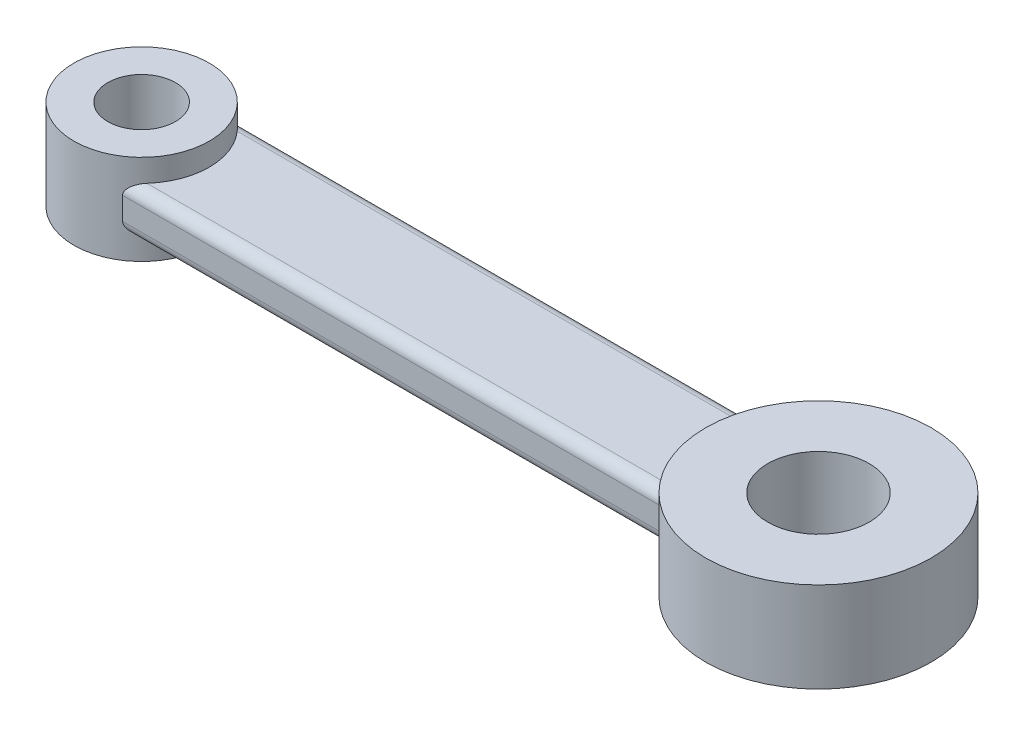
ISO-10303-21;
HEADER;
FILE_DESCRIPTION(('STEP AP214'),'2;1');
FILE_NAME('part.step','',(''),(''),'','','');
FILE_SCHEMA(('AUTOMOTIVE_DESIGN { 1 0 10303 214 1 1 1 1 }'));
ENDSEC;
DATA;
#1=APPLICATION_CONTEXT('core data for automotive mechanical design processes');
#2=APPLICATION_PROTOCOL_DEFINITION('international standard','automotive_design',2000,#1);
#3=PRODUCT_CONTEXT('',#1,'mechanical');
#4=PRODUCT('Part','Part','',(#3));
#5=PRODUCT_RELATED_PRODUCT_CATEGORY('part','',(#4));
#6=PRODUCT_DEFINITION_FORMATION('','',#4);
#7=PRODUCT_DEFINITION_CONTEXT('part definition',#1,'design');
#8=PRODUCT_DEFINITION('design','',#6,#7);
#9=PRODUCT_DEFINITION_SHAPE('','',#8);
#10=(LENGTH_UNIT() NAMED_UNIT(*) SI_UNIT(.MILLI.,.METRE.));
#11=(NAMED_UNIT(*) PLANE_ANGLE_UNIT() SI_UNIT($,.RADIAN.));
#12=(NAMED_UNIT(*) SI_UNIT($,.STERADIAN.) SOLID_ANGLE_UNIT());
#13=UNCERTAINTY_MEASURE_WITH_UNIT(LENGTH_MEASURE(1.E-05),#10,'distance_accuracy_value','');
#14=(GEOMETRIC_REPRESENTATION_CONTEXT(3) GLOBAL_UNCERTAINTY_ASSIGNED_CONTEXT((#13)) GLOBAL_UNIT_ASSIGNED_CONTEXT((#10,
#11,#12)) REPRESENTATION_CONTEXT('',''));
#15=CARTESIAN_POINT('',(0.,0.,0.));
#16=DIRECTION('',(0.,0.,1.));
#17=DIRECTION('',(1.,0.,0.));
#18=AXIS2_PLACEMENT_3D('',#15,#16,#17);
#19=CARTESIAN_POINT('',(-15.,1.,-2.5));
#20=DIRECTION('',(0.,0.,1.));
#21=DIRECTION('',(1.,0.,0.));
#22=AXIS2_PLACEMENT_3D('',#19,#20,#21);
#23=PLANE('',#22);
#24=DIRECTION('',(0.,1.,0.));
#25=VECTOR('',#24,1.);
#26=CARTESIAN_POINT('',(10.6698729810778,-2.,-2.5));
#27=LINE('',#26,#25);
#28=CARTESIAN_POINT('',(10.6698729810778,0.5,-2.5));
#29=VERTEX_POINT('',#28);
#30=CARTESIAN_POINT('',(10.6698729810778,-0.5,-2.5));
#31=VERTEX_POINT('',#30);
#32=EDGE_CURVE('E143',#29,#31,#27,.F.);
#33=ORIENTED_EDGE('',*,*,#32,.T.);
#34=DIRECTION('',(-1.,0.,0.));
#35=VECTOR('',#34,1.);
#36=CARTESIAN_POINT('',(-13.3416876048223,-0.5,-2.5));
#37=LINE('',#36,#35);
#38=CARTESIAN_POINT('',(-13.3416876048223,-0.5,-2.5));
#39=VERTEX_POINT('',#38);
#40=EDGE_CURVE('E270',#31,#39,#37,.T.);
#41=ORIENTED_EDGE('',*,*,#40,.T.);
#42=DIRECTION('',(0.,1.,0.));
#43=VECTOR('',#42,1.);
#44=CARTESIAN_POINT('',(-13.3416876048223,-2.,-2.5));
#45=LINE('',#44,#43);
#46=CARTESIAN_POINT('',(-13.3416876048223,0.5,-2.5));
#47=VERTEX_POINT('',#46);
#48=EDGE_CURVE('E161',#39,#47,#45,.T.);
#49=ORIENTED_EDGE('',*,*,#48,.T.);
#50=DIRECTION('',(-1.,0.,0.));
#51=VECTOR('',#50,1.);
#52=CARTESIAN_POINT('',(-15.,0.5,-2.5));
#53=LINE('',#52,#51);
#54=EDGE_CURVE('E123',#47,#29,#53,.F.);
#55=ORIENTED_EDGE('',*,*,#54,.T.);
#56=EDGE_LOOP('',(#33,#41,#49,#55));
#57=FACE_BOUND('',#56,.T.);
#58=ADVANCED_FACE('F39',(#57),#23,.F.);
#59=CARTESIAN_POINT('',(-15.,1.,2.5));
#60=DIRECTION('',(0.,0.,-1.));
#61=DIRECTION('',(-1.,0.,0.));
#62=AXIS2_PLACEMENT_3D('',#59,#60,#61);
#63=PLANE('',#62);
#64=DIRECTION('',(0.,1.,0.));
#65=VECTOR('',#64,1.);
#66=CARTESIAN_POINT('',(-13.3416876048223,-2.,2.5));
#67=LINE('',#66,#65);
#68=CARTESIAN_POINT('',(-13.3416876048223,0.5,2.5));
#69=VERTEX_POINT('',#68);
#70=CARTESIAN_POINT('',(-13.3416876048223,-0.5,2.5));
#71=VERTEX_POINT('',#70);
#72=EDGE_CURVE('E158',#69,#71,#67,.F.);
#73=ORIENTED_EDGE('',*,*,#72,.T.);
#74=DIRECTION('',(1.,0.,0.));
#75=VECTOR('',#74,1.);
#76=CARTESIAN_POINT('',(10.6698729810778,-0.5,2.5));
#77=LINE('',#76,#75);
#78=CARTESIAN_POINT('',(10.6698729810778,-0.5,2.5));
#79=VERTEX_POINT('',#78);
#80=EDGE_CURVE('E283',#71,#79,#77,.T.);
#81=ORIENTED_EDGE('',*,*,#80,.T.);
#82=DIRECTION('',(0.,1.,0.));
#83=VECTOR('',#82,1.);
#84=CARTESIAN_POINT('',(10.6698729810778,-2.,2.5));
#85=LINE('',#84,#83);
#86=CARTESIAN_POINT('',(10.6698729810778,0.5,2.5));
#87=VERTEX_POINT('',#86);
#88=EDGE_CURVE('E151',#79,#87,#85,.T.);
#89=ORIENTED_EDGE('',*,*,#88,.T.);
#90=DIRECTION('',(1.,0.,0.));
#91=VECTOR('',#90,1.);
#92=CARTESIAN_POINT('',(-15.,0.5,2.5));
#93=LINE('',#92,#91);
#94=EDGE_CURVE('E117',#87,#69,#93,.F.);
#95=ORIENTED_EDGE('',*,*,#94,.T.);
#96=EDGE_LOOP('',(#73,#81,#89,#95));
#97=FACE_BOUND('',#96,.T.);
#98=ADVANCED_FACE('F258',(#97),#63,.F.);
#99=CARTESIAN_POINT('',(0.,1.,0.));
#100=DIRECTION('',(0.,-1.,0.));
#101=DIRECTION('',(0.,0.,-1.));
#102=AXIS2_PLACEMENT_3D('',#99,#100,#101);
#103=PLANE('',#102);
#104=CARTESIAN_POINT('',(-15.,1.,0.));
#105=DIRECTION('',(0.,-1.,0.));
#106=DIRECTION('',(0.,0.,-1.));
#107=AXIS2_PLACEMENT_3D('',#104,#105,#106);
#108=CIRCLE('',#107,3.);
#109=CARTESIAN_POINT('',(-12.7639320225002,1.,-2.));
#110=VERTEX_POINT('',#109);
#111=CARTESIAN_POINT('',(-12.7639320225002,1.,2.));
#112=VERTEX_POINT('',#111);
#113=EDGE_CURVE('E133',#110,#112,#108,.T.);
#114=ORIENTED_EDGE('',*,*,#113,.T.);
#115=DIRECTION('',(1.,0.,0.));
#116=VECTOR('',#115,1.);
#117=CARTESIAN_POINT('',(0.,1.,2.));
#118=LINE('',#117,#116);
#119=CARTESIAN_POINT('',(10.4174243050442,1.,2.));
#120=VERTEX_POINT('',#119);
#121=EDGE_CURVE('E116',#112,#120,#118,.T.);
#122=ORIENTED_EDGE('',*,*,#121,.T.);
#123=CARTESIAN_POINT('',(15.,1.,0.));
#124=DIRECTION('',(0.,-1.,0.));
#125=DIRECTION('',(0.,0.,-1.));
#126=AXIS2_PLACEMENT_3D('',#123,#124,#125);
#127=CIRCLE('',#126,5.);
#128=CARTESIAN_POINT('',(10.4174243050442,1.,-2.));
#129=VERTEX_POINT('',#128);
#130=EDGE_CURVE('E130',#120,#129,#127,.T.);
#131=ORIENTED_EDGE('',*,*,#130,.T.);
#132=DIRECTION('',(-1.,0.,0.));
#133=VECTOR('',#132,1.);
#134=CARTESIAN_POINT('',(0.,1.,-2.));
#135=LINE('',#134,#133);
#136=EDGE_CURVE('E135',#129,#110,#135,.T.);
#137=ORIENTED_EDGE('',*,*,#136,.T.);
#138=EDGE_LOOP('',(#114,#122,#131,#137));
#139=FACE_BOUND('',#138,.T.);
#140=ADVANCED_FACE('F128',(#139),#103,.F.);
#141=CARTESIAN_POINT('',(0.,-1.,0.));
#142=DIRECTION('',(0.,-1.,0.));
#143=DIRECTION('',(0.,0.,-1.));
#144=AXIS2_PLACEMENT_3D('',#141,#142,#143);
#145=PLANE('',#144);
#146=CARTESIAN_POINT('',(-15.,-1.,0.));
#147=DIRECTION('',(0.,-1.,0.));
#148=DIRECTION('',(0.,0.,-1.));
#149=AXIS2_PLACEMENT_3D('',#146,#147,#148);
#150=CIRCLE('',#149,3.);
#151=CARTESIAN_POINT('',(-12.7639320225002,-1.,-2.));
#152=VERTEX_POINT('',#151);
#153=CARTESIAN_POINT('',(-12.7639320225002,-1.,2.));
#154=VERTEX_POINT('',#153);
#155=EDGE_CURVE('E166',#152,#154,#150,.T.);
#156=ORIENTED_EDGE('',*,*,#155,.F.);
#157=DIRECTION('',(-1.,0.,0.));
#158=VECTOR('',#157,1.);
#159=CARTESIAN_POINT('',(10.6698729810778,-1.,-2.));
#160=LINE('',#159,#158);
#161=CARTESIAN_POINT('',(10.4174243050442,-1.,-2.));
#162=VERTEX_POINT('',#161);
#163=EDGE_CURVE('E279',#152,#162,#160,.F.);
#164=ORIENTED_EDGE('',*,*,#163,.T.);
#165=CARTESIAN_POINT('',(15.,-1.,0.));
#166=DIRECTION('',(0.,-1.,0.));
#167=DIRECTION('',(0.,0.,-1.));
#168=AXIS2_PLACEMENT_3D('',#165,#166,#167);
#169=CIRCLE('',#168,5.);
#170=CARTESIAN_POINT('',(10.4174243050442,-1.,2.));
#171=VERTEX_POINT('',#170);
#172=EDGE_CURVE('E169',#171,#162,#169,.T.);
#173=ORIENTED_EDGE('',*,*,#172,.F.);
#174=DIRECTION('',(1.,0.,0.));
#175=VECTOR('',#174,1.);
#176=CARTESIAN_POINT('',(-13.3416876048223,-1.,2.));
#177=LINE('',#176,#175);
#178=EDGE_CURVE('E276',#171,#154,#177,.F.);
#179=ORIENTED_EDGE('',*,*,#178,.T.);
#180=EDGE_LOOP('',(#156,#164,#173,#179));
#181=FACE_BOUND('',#180,.T.);
#182=ADVANCED_FACE('F251',(#181),#145,.T.);
#183=CARTESIAN_POINT('',(-15.,-2.,0.));
#184=DIRECTION('',(0.,1.,0.));
#185=DIRECTION('',(0.,0.,1.));
#186=AXIS2_PLACEMENT_3D('',#183,#184,#185);
#187=CYLINDRICAL_SURFACE('',#186,3.);
#188=CARTESIAN_POINT('',(-15.,2.,0.));
#189=DIRECTION('',(0.,1.,0.));
#190=DIRECTION('',(0.,0.,1.));
#191=AXIS2_PLACEMENT_3D('',#188,#189,#190);
#192=CIRCLE('',#191,3.);
#193=CARTESIAN_POINT('',(-15.,2.,3.));
#194=VERTEX_POINT('',#193);
#195=EDGE_CURVE('E142',#194,#194,#192,.T.);
#196=ORIENTED_EDGE('',*,*,#195,.F.);
#197=EDGE_LOOP('',(#196));
#198=FACE_BOUND('',#197,.T.);
#199=CARTESIAN_POINT('',(-15.,-2.,0.));
#200=DIRECTION('',(0.,1.,0.));
#201=DIRECTION('',(0.,0.,1.));
#202=AXIS2_PLACEMENT_3D('',#199,#200,#201);
#203=CIRCLE('',#202,3.);
#204=CARTESIAN_POINT('',(-15.,-2.,3.));
#205=VERTEX_POINT('',#204);
#206=EDGE_CURVE('E148',#205,#205,#203,.T.);
#207=ORIENTED_EDGE('',*,*,#206,.T.);
#208=EDGE_LOOP('',(#207));
#209=FACE_BOUND('',#208,.T.);
#210=ORIENTED_EDGE('',*,*,#113,.F.);
#211=CARTESIAN_POINT('',(-12.7639320225002,1.,-2.));
#212=CARTESIAN_POINT('',(-12.7813654476687,0.999994445505588,-2.01949359100221));
#213=CARTESIAN_POINT('',(-12.7990411982709,0.998860689409976,-2.03873973865839));
#214=CARTESIAN_POINT('',(-12.8347538799835,0.994462119045316,-2.07662835943884));
#215=CARTESIAN_POINT('',(-12.852790626118,0.991198370402259,-2.09527112953772));
#216=CARTESIAN_POINT('',(-12.9076020696579,0.978323441096924,-2.15048074103013));
#217=CARTESIAN_POINT('',(-12.9447688062129,0.965632732151298,-2.18598404750585));
#218=CARTESIAN_POINT('',(-13.0192478946805,0.932517419205082,-2.25370503782496));
#219=CARTESIAN_POINT('',(-13.0565586313246,0.91202546732388,-2.28589091694261));
#220=CARTESIAN_POINT('',(-13.1293986280466,0.863149345748445,-2.34585586658739));
#221=CARTESIAN_POINT('',(-13.1649355034373,0.834803098801269,-2.37365512924547));
#222=CARTESIAN_POINT('',(-13.2134157867939,0.786693537335127,-2.41008159609968));
#223=CARTESIAN_POINT('',(-13.2282305627463,0.77051442886312,-2.4209784232059));
#224=CARTESIAN_POINT('',(-13.2563018122169,0.735966323835231,-2.44127284364817));
#225=CARTESIAN_POINT('',(-13.2695588902018,0.717598182347025,-2.4506710190469));
#226=CARTESIAN_POINT('',(-13.2916368924699,0.681832933624495,-2.4660993865668));
#227=CARTESIAN_POINT('',(-13.3008288662582,0.664798901283837,-2.47243043798102));
#228=CARTESIAN_POINT('',(-13.316869821903,0.629191119527252,-2.48337805890216));
#229=CARTESIAN_POINT('',(-13.323728233179,0.610623952757903,-2.48800153498784));
#230=CARTESIAN_POINT('',(-13.3331088580339,0.576776472396585,-2.4942934128244));
#231=CARTESIAN_POINT('',(-13.3362732595262,0.561758751665526,-2.49640228766915));
#232=CARTESIAN_POINT('',(-13.3405867010465,0.531177106703895,-2.49926985925382));
#233=CARTESIAN_POINT('',(-13.341717317729,0.515609479249297,-2.50001621429648));
#234=CARTESIAN_POINT('',(-13.3416876048223,0.5,-2.5));
#235=B_SPLINE_CURVE_WITH_KNOTS('',3,(#211,#212,#213,#214,#215,#216,#217,#218,#219,#220,#221,
#222,#223,#224,#225,#226,#227,#228,#229,#230,#231,#232,#233,#234),.UNSPECIFIED.,.F.,.F.,(4,2,2,
2,2,2,2,2,2,2,2,4),(0.,0.0783898255899012,0.156740463124989,0.314814052922462,0.474284423262263,
0.632997854342967,0.706343937197132,0.779661463349925,0.840552451401913,0.901194386001923,
0.947478734399757,0.994180284616168),.UNSPECIFIED.);
#236=EDGE_CURVE('E239',#110,#47,#235,.T.);
#237=ORIENTED_EDGE('',*,*,#236,.T.);
#238=ORIENTED_EDGE('',*,*,#48,.F.);
#239=CARTESIAN_POINT('',(-13.3416876048223,-0.5,-2.5));
#240=CARTESIAN_POINT('',(-13.3417261843022,-0.516822828872651,-2.50002105286584));
#241=CARTESIAN_POINT('',(-13.3404092208518,-0.533588035639853,-2.49915221414259));
#242=CARTESIAN_POINT('',(-13.3354207657719,-0.5664186633773,-2.49583463220209));
#243=CARTESIAN_POINT('',(-13.331775766552,-0.58248981299817,-2.49340366371562));
#244=CARTESIAN_POINT('',(-13.3212853755202,-0.617734402460636,-2.48635547100785));
#245=CARTESIAN_POINT('',(-13.3138602042168,-0.636651250821247,-2.4813383345804));
#246=CARTESIAN_POINT('',(-13.2966528423177,-0.672857175590583,-2.46955837238611));
#247=CARTESIAN_POINT('',(-13.2868594057681,-0.690137920998039,-2.46278720615986));
#248=CARTESIAN_POINT('',(-13.2598012797917,-0.732020883020507,-2.4437894695714));
#249=CARTESIAN_POINT('',(-13.2413857026041,-0.755437426624356,-2.43060816292195));
#250=CARTESIAN_POINT('',(-13.2023221847601,-0.79862956558678,-2.40186392098692));
#251=CARTESIAN_POINT('',(-13.181669278916,-0.818396788205838,-2.38629565530459));
#252=CARTESIAN_POINT('',(-13.1272613592604,-0.864813010713485,-2.34405563022038));
#253=CARTESIAN_POINT('',(-13.0926078348558,-0.889174909431484,-2.31602411273898));
#254=CARTESIAN_POINT('',(-13.0223124130272,-0.930852018605409,-2.25630082488321));
#255=CARTESIAN_POINT('',(-12.9866699758398,-0.948163296566734,-2.22460702448013));
#256=CARTESIAN_POINT('',(-12.9192688936088,-0.974262726817669,-2.16158611525089));
#257=CARTESIAN_POINT('',(-12.8874952717848,-0.983754765132756,-2.13056968957407));
#258=CARTESIAN_POINT('',(-12.8405209139538,-0.993401569683879,-2.08258288363253));
#259=CARTESIAN_POINT('',(-12.8249971533039,-0.995851742814894,-2.06636592206632));
#260=CARTESIAN_POINT('',(-12.7942318431726,-0.999149835544836,-2.03349327256699));
#261=CARTESIAN_POINT('',(-12.7789904352089,-0.999996972112432,-2.01683737425293));
#262=CARTESIAN_POINT('',(-12.7639320225002,-1.,-2.));
#263=B_SPLINE_CURVE_WITH_KNOTS('',3,(#239,#240,#241,#242,#243,#244,#245,#246,#247,#248,#249,
#250,#251,#252,#253,#254,#255,#256,#257,#258,#259,#260,#261,#262),.UNSPECIFIED.,.F.,.F.,(4,2,2,
2,2,2,2,2,2,2,2,4),(0.,0.0503015075969909,0.100040556265486,0.162488885380412,0.225239790152478,
0.322423307703855,0.419827097896708,0.571404223192908,0.723065775469024,0.858808614579746,
0.926501808526239,0.994228059873951),.UNSPECIFIED.);
#264=EDGE_CURVE('E219',#39,#152,#263,.T.);
#265=ORIENTED_EDGE('',*,*,#264,.T.);
#266=ORIENTED_EDGE('',*,*,#155,.T.);
#267=CARTESIAN_POINT('',(-12.7639320225002,-1.,2.));
#268=CARTESIAN_POINT('',(-12.7813654476687,-0.999994445505588,2.01949359100221));
#269=CARTESIAN_POINT('',(-12.7990411982709,-0.998860689409976,2.03873973865839));
#270=CARTESIAN_POINT('',(-12.8347538799835,-0.994462119045316,2.07662835943884));
#271=CARTESIAN_POINT('',(-12.852790626118,-0.991198370402259,2.09527112953772));
#272=CARTESIAN_POINT('',(-12.9076020696579,-0.978323441096924,2.15048074103013));
#273=CARTESIAN_POINT('',(-12.9447688062129,-0.965632732151298,2.18598404750585));
#274=CARTESIAN_POINT('',(-13.0192478946805,-0.932517419205082,2.25370503782496));
#275=CARTESIAN_POINT('',(-13.0565586313246,-0.91202546732388,2.28589091694261));
#276=CARTESIAN_POINT('',(-13.1293986280466,-0.863149345748445,2.34585586658739));
#277=CARTESIAN_POINT('',(-13.1649355034373,-0.834803098801269,2.37365512924547));
#278=CARTESIAN_POINT('',(-13.2134157867939,-0.786693537335127,2.41008159609968));
#279=CARTESIAN_POINT('',(-13.2282305627463,-0.77051442886312,2.4209784232059));
#280=CARTESIAN_POINT('',(-13.2563018122169,-0.735966323835231,2.44127284364817));
#281=CARTESIAN_POINT('',(-13.2695588902018,-0.717598182347025,2.4506710190469));
#282=CARTESIAN_POINT('',(-13.2916368924699,-0.681832933624495,2.4660993865668));
#283=CARTESIAN_POINT('',(-13.3008288662582,-0.664798901283837,2.47243043798102));
#284=CARTESIAN_POINT('',(-13.316869821903,-0.629191119527252,2.48337805890216));
#285=CARTESIAN_POINT('',(-13.323728233179,-0.610623952757903,2.48800153498784));
#286=CARTESIAN_POINT('',(-13.3331088580339,-0.576776472396585,2.4942934128244));
#287=CARTESIAN_POINT('',(-13.3362732595262,-0.561758751665526,2.49640228766915));
#288=CARTESIAN_POINT('',(-13.3405867010465,-0.531177106703895,2.49926985925382));
#289=CARTESIAN_POINT('',(-13.341717317729,-0.515609479249297,2.50001621429648));
#290=CARTESIAN_POINT('',(-13.3416876048223,-0.5,2.5));
#291=B_SPLINE_CURVE_WITH_KNOTS('',3,(#267,#268,#269,#270,#271,#272,#273,#274,#275,#276,#277,
#278,#279,#280,#281,#282,#283,#284,#285,#286,#287,#288,#289,#290),.UNSPECIFIED.,.F.,.F.,(4,2,2,
2,2,2,2,2,2,2,2,4),(0.,0.0783898255899012,0.156740463124989,0.314814052922462,0.474284423262263,
0.632997854342967,0.706343937197132,0.779661463349925,0.840552451401913,0.901194386001923,
0.947478734399757,0.994180284616168),.UNSPECIFIED.);
#292=EDGE_CURVE('E11',#154,#71,#291,.T.);
#293=ORIENTED_EDGE('',*,*,#292,.T.);
#294=ORIENTED_EDGE('',*,*,#72,.F.);
#295=CARTESIAN_POINT('',(-13.3416876048223,0.5,2.5));
#296=CARTESIAN_POINT('',(-13.3417261843022,0.516822828872651,2.50002105286584));
#297=CARTESIAN_POINT('',(-13.3404092208518,0.533588035639853,2.49915221414259));
#298=CARTESIAN_POINT('',(-13.3354207657719,0.5664186633773,2.49583463220209));
#299=CARTESIAN_POINT('',(-13.331775766552,0.58248981299817,2.49340366371562));
#300=CARTESIAN_POINT('',(-13.3212853755202,0.617734402460636,2.48635547100785));
#301=CARTESIAN_POINT('',(-13.3138602042168,0.636651250821247,2.4813383345804));
#302=CARTESIAN_POINT('',(-13.2966528423177,0.672857175590583,2.46955837238611));
#303=CARTESIAN_POINT('',(-13.2868594057681,0.690137920998039,2.46278720615986));
#304=CARTESIAN_POINT('',(-13.2598012797917,0.732020883020507,2.4437894695714));
#305=CARTESIAN_POINT('',(-13.2413857026041,0.755437426624356,2.43060816292195));
#306=CARTESIAN_POINT('',(-13.2023221847601,0.79862956558678,2.40186392098692));
#307=CARTESIAN_POINT('',(-13.181669278916,0.818396788205838,2.38629565530459));
#308=CARTESIAN_POINT('',(-13.1272613592604,0.864813010713485,2.34405563022038));
#309=CARTESIAN_POINT('',(-13.0926078348558,0.889174909431484,2.31602411273898));
#310=CARTESIAN_POINT('',(-13.0223124130272,0.930852018605409,2.25630082488321));
#311=CARTESIAN_POINT('',(-12.9866699758398,0.948163296566734,2.22460702448013));
#312=CARTESIAN_POINT('',(-12.9192688936088,0.974262726817669,2.16158611525089));
#313=CARTESIAN_POINT('',(-12.8874952717848,0.983754765132756,2.13056968957407));
#314=CARTESIAN_POINT('',(-12.8405209139538,0.993401569683879,2.08258288363253));
#315=CARTESIAN_POINT('',(-12.8249971533039,0.995851742814894,2.06636592206632));
#316=CARTESIAN_POINT('',(-12.7942318431726,0.999149835544836,2.03349327256699));
#317=CARTESIAN_POINT('',(-12.7789904352089,0.999996972112432,2.01683737425293));
#318=CARTESIAN_POINT('',(-12.7639320225002,1.,2.));
#319=B_SPLINE_CURVE_WITH_KNOTS('',3,(#295,#296,#297,#298,#299,#300,#301,#302,#303,#304,#305,
#306,#307,#308,#309,#310,#311,#312,#313,#314,#315,#316,#317,#318),.UNSPECIFIED.,.F.,.F.,(4,2,2,
2,2,2,2,2,2,2,2,4),(0.,0.0503015075969909,0.100040556265486,0.162488885380412,0.225239790152478,
0.322423307703855,0.419827097896708,0.571404223192908,0.723065775469024,0.858808614579746,
0.926501808526239,0.994228059873951),.UNSPECIFIED.);
#320=EDGE_CURVE('E122',#69,#112,#319,.T.);
#321=ORIENTED_EDGE('',*,*,#320,.T.);
#322=EDGE_LOOP('',(#210,#237,#238,#265,#266,#293,#294,#321));
#323=FACE_BOUND('',#322,.T.);
#324=ADVANCED_FACE('F246',(#198,#209,#323),#187,.T.);
#325=CARTESIAN_POINT('',(-15.,-2.,0.));
#326=DIRECTION('',(0.,1.,0.));
#327=DIRECTION('',(0.,0.,1.));
#328=AXIS2_PLACEMENT_3D('',#325,#326,#327);
#329=PLANE('',#328);
#330=CARTESIAN_POINT('',(-15.,-2.,0.));
#331=DIRECTION('',(0.,1.,0.));
#332=DIRECTION('',(0.,0.,1.));
#333=AXIS2_PLACEMENT_3D('',#330,#331,#332);
#334=CIRCLE('',#333,1.5);
#335=CARTESIAN_POINT('',(-15.,-2.,1.5));
#336=VERTEX_POINT('',#335);
#337=EDGE_CURVE('E404',#336,#336,#334,.T.);
#338=ORIENTED_EDGE('',*,*,#337,.T.);
#339=EDGE_LOOP('',(#338));
#340=FACE_BOUND('',#339,.T.);
#341=ORIENTED_EDGE('',*,*,#206,.F.);
#342=EDGE_LOOP('',(#341));
#343=FACE_BOUND('',#342,.T.);
#344=ADVANCED_FACE('F250',(#340,#343),#329,.F.);
#345=CARTESIAN_POINT('',(-15.,2.,0.));
#346=DIRECTION('',(0.,1.,0.));
#347=DIRECTION('',(0.,0.,1.));
#348=AXIS2_PLACEMENT_3D('',#345,#346,#347);
#349=PLANE('',#348);
#350=CARTESIAN_POINT('',(-15.,2.,0.));
#351=DIRECTION('',(0.,1.,0.));
#352=DIRECTION('',(0.,0.,1.));
#353=AXIS2_PLACEMENT_3D('',#350,#351,#352);
#354=CIRCLE('',#353,1.5);
#355=CARTESIAN_POINT('',(-15.,2.,1.5));
#356=VERTEX_POINT('',#355);
#357=EDGE_CURVE('E418',#356,#356,#354,.T.);
#358=ORIENTED_EDGE('',*,*,#357,.F.);
#359=EDGE_LOOP('',(#358));
#360=FACE_BOUND('',#359,.T.);
#361=ORIENTED_EDGE('',*,*,#195,.T.);
#362=EDGE_LOOP('',(#361));
#363=FACE_BOUND('',#362,.T.);
#364=ADVANCED_FACE('F198',(#360,#363),#349,.T.);
#365=CARTESIAN_POINT('',(15.,-2.,0.));
#366=DIRECTION('',(0.,1.,0.));
#367=DIRECTION('',(0.,0.,1.));
#368=AXIS2_PLACEMENT_3D('',#365,#366,#367);
#369=CYLINDRICAL_SURFACE('',#368,5.);
#370=CARTESIAN_POINT('',(15.,2.,0.));
#371=DIRECTION('',(0.,1.,0.));
#372=DIRECTION('',(0.,0.,1.));
#373=AXIS2_PLACEMENT_3D('',#370,#371,#372);
#374=CIRCLE('',#373,5.);
#375=CARTESIAN_POINT('',(15.,2.,5.));
#376=VERTEX_POINT('',#375);
#377=EDGE_CURVE('E409',#376,#376,#374,.T.);
#378=ORIENTED_EDGE('',*,*,#377,.F.);
#379=EDGE_LOOP('',(#378));
#380=FACE_BOUND('',#379,.T.);
#381=CARTESIAN_POINT('',(15.,-2.,0.));
#382=DIRECTION('',(0.,1.,0.));
#383=DIRECTION('',(0.,0.,1.));
#384=AXIS2_PLACEMENT_3D('',#381,#382,#383);
#385=CIRCLE('',#384,5.);
#386=CARTESIAN_POINT('',(15.,-2.,5.));
#387=VERTEX_POINT('',#386);
#388=EDGE_CURVE('E415',#387,#387,#385,.T.);
#389=ORIENTED_EDGE('',*,*,#388,.T.);
#390=EDGE_LOOP('',(#389));
#391=FACE_BOUND('',#390,.T.);
#392=ORIENTED_EDGE('',*,*,#130,.F.);
#393=CARTESIAN_POINT('',(10.4174243050442,1.,2.));
#394=CARTESIAN_POINT('',(10.4308993122192,1.00000668411266,2.03090713408897));
#395=CARTESIAN_POINT('',(10.4447039401755,0.997135472019669,2.06165377228773));
#396=CARTESIAN_POINT('',(10.4725286894914,0.985847081121915,2.1220451699756));
#397=CARTESIAN_POINT('',(10.4865489837027,0.977425200239371,2.15168897271939));
#398=CARTESIAN_POINT('',(10.5143400785477,0.955243483074812,2.20904517815308));
#399=CARTESIAN_POINT('',(10.5281108215857,0.941482430543113,2.23675713907633));
#400=CARTESIAN_POINT('',(10.5548568403228,0.90887514057721,2.28944814596292));
#401=CARTESIAN_POINT('',(10.5678322674685,0.890029875009769,2.31442771295254));
#402=CARTESIAN_POINT('',(10.5920858366771,0.848049596030432,2.36028643277072));
#403=CARTESIAN_POINT('',(10.6033953938408,0.825019699021244,2.38124465132102));
#404=CARTESIAN_POINT('',(10.6239700555222,0.774857640279251,2.41884733117823));
#405=CARTESIAN_POINT('',(10.6332362447518,0.747727668005086,2.43549408202948));
#406=CARTESIAN_POINT('',(10.6481452710197,0.693260940033863,2.46202512624276));
#407=CARTESIAN_POINT('',(10.6540714225199,0.666263235098591,2.47244574035165));
#408=CARTESIAN_POINT('',(10.6632424806366,0.610480842853648,2.48849793296531));
#409=CARTESIAN_POINT('',(10.6664949910704,0.58170147536064,2.49414309416744));
#410=CARTESIAN_POINT('',(10.6688048900758,0.543880128652656,2.49814915942994));
#411=CARTESIAN_POINT('',(10.6692052417715,0.535117663391557,2.49884310090582));
#412=CARTESIAN_POINT('',(10.6697389009958,0.517571703120912,2.49976785029613));
#413=CARTESIAN_POINT('',(10.6698725567911,0.508788250553156,2.4999992622088));
#414=CARTESIAN_POINT('',(10.6698729810778,0.499999999999999,2.5));
#415=B_SPLINE_CURVE_WITH_KNOTS('',3,(#393,#394,#395,#396,#397,#398,#399,#400,#401,#402,#403,
#404,#405,#406,#407,#408,#409,#410,#411,#412,#413,#414),.UNSPECIFIED.,.F.,.F.,(4,2,2,2,2,2,2,2,
2,2,4),(0.,0.101008056687019,0.202101789401094,0.303218564543173,0.404316024505445,
0.5031573664606,0.601946111988946,0.690061209732679,0.777924833155257,0.804310453809253,
0.830661596001267),.UNSPECIFIED.);
#416=EDGE_CURVE('E112',#120,#87,#415,.T.);
#417=ORIENTED_EDGE('',*,*,#416,.T.);
#418=ORIENTED_EDGE('',*,*,#88,.F.);
#419=CARTESIAN_POINT('',(10.6698729810778,-0.5,2.5));
#420=CARTESIAN_POINT('',(10.6698985355678,-0.525612881621549,2.50003287097852));
#421=CARTESIAN_POINT('',(10.6687380943918,-0.551192250511684,2.49803439435345));
#422=CARTESIAN_POINT('',(10.6642525448032,-0.601452812449729,2.4902467325129));
#423=CARTESIAN_POINT('',(10.660937695083,-0.626137679730771,2.4844755112987));
#424=CARTESIAN_POINT('',(10.6523519091098,-0.674007047252389,2.46941816042085));
#425=CARTESIAN_POINT('',(10.6470831491012,-0.697193183151707,2.4601359410405));
#426=CARTESIAN_POINT('',(10.634898343239,-0.741602484171483,2.43845092893676));
#427=CARTESIAN_POINT('',(10.6279806704541,-0.762823681652599,2.42604505351337));
#428=CARTESIAN_POINT('',(10.6123827180238,-0.804100789207547,2.39772599891138));
#429=CARTESIAN_POINT('',(10.6036223097161,-0.824013239100391,2.38164860868134));
#430=CARTESIAN_POINT('',(10.5850117154092,-0.860906890769571,2.34696954655862));
#431=CARTESIAN_POINT('',(10.5751611545275,-0.87788707902639,2.3283670058143));
#432=CARTESIAN_POINT('',(10.5534319049278,-0.910652876745179,2.28662446045481));
#433=CARTESIAN_POINT('',(10.5414538612551,-0.926020801860714,2.26320800664285));
#434=CARTESIAN_POINT('',(10.5169891099007,-0.952577466309947,2.21435359560162));
#435=CARTESIAN_POINT('',(10.5045021720283,-0.963764290584012,2.18891471849988));
#436=CARTESIAN_POINT('',(10.4794346311887,-0.981751717696796,2.13666090445053));
#437=CARTESIAN_POINT('',(10.4668543431243,-0.988563290873172,2.10984959258686));
#438=CARTESIAN_POINT('',(10.4419031729363,-0.997688369801676,2.05540070834236));
#439=CARTESIAN_POINT('',(10.4295321600039,-1.00000479665528,2.02776368440381));
#440=CARTESIAN_POINT('',(10.4174243050442,-1.,2.));
#441=B_SPLINE_CURVE_WITH_KNOTS('',3,(#419,#420,#421,#422,#423,#424,#425,#426,#427,#428,#429,
#430,#431,#432,#433,#434,#435,#436,#437,#438,#439,#440),.UNSPECIFIED.,.F.,.F.,(4,2,2,2,2,2,2,2,
2,2,4),(0.,0.0766818511881102,0.153001213844694,0.229235826870433,0.305545971876533,
0.386375804023659,0.467233518862885,0.558243654907134,0.649295425170199,0.740117995204918,
0.83088152580391),.UNSPECIFIED.);
#442=EDGE_CURVE('E54',#79,#171,#441,.T.);
#443=ORIENTED_EDGE('',*,*,#442,.T.);
#444=ORIENTED_EDGE('',*,*,#172,.T.);
#445=CARTESIAN_POINT('',(10.4174243050442,-1.,-2.));
#446=CARTESIAN_POINT('',(10.4308993122192,-1.00000668411266,-2.03090713408897));
#447=CARTESIAN_POINT('',(10.4447039401755,-0.997135472019669,-2.06165377228773));
#448=CARTESIAN_POINT('',(10.4725286894914,-0.985847081121915,-2.1220451699756));
#449=CARTESIAN_POINT('',(10.4865489837027,-0.977425200239371,-2.15168897271939));
#450=CARTESIAN_POINT('',(10.5143400785477,-0.955243483074812,-2.20904517815308));
#451=CARTESIAN_POINT('',(10.5281108215857,-0.941482430543113,-2.23675713907633));
#452=CARTESIAN_POINT('',(10.5548568403228,-0.90887514057721,-2.28944814596292));
#453=CARTESIAN_POINT('',(10.5678322674685,-0.890029875009769,-2.31442771295254));
#454=CARTESIAN_POINT('',(10.5920858366771,-0.848049596030432,-2.36028643277072));
#455=CARTESIAN_POINT('',(10.6033953938408,-0.825019699021244,-2.38124465132102));
#456=CARTESIAN_POINT('',(10.6239700555222,-0.774857640279251,-2.41884733117823));
#457=CARTESIAN_POINT('',(10.6332362447518,-0.747727668005086,-2.43549408202948));
#458=CARTESIAN_POINT('',(10.6481452710197,-0.693260940033863,-2.46202512624276));
#459=CARTESIAN_POINT('',(10.6540714225199,-0.666263235098591,-2.47244574035165));
#460=CARTESIAN_POINT('',(10.6632424806366,-0.610480842853648,-2.48849793296531));
#461=CARTESIAN_POINT('',(10.6664949910704,-0.58170147536064,-2.49414309416744));
#462=CARTESIAN_POINT('',(10.6688048900758,-0.543880128652656,-2.49814915942994));
#463=CARTESIAN_POINT('',(10.6692052417715,-0.535117663391557,-2.49884310090582));
#464=CARTESIAN_POINT('',(10.6697389009958,-0.517571703120912,-2.49976785029613));
#465=CARTESIAN_POINT('',(10.6698725567911,-0.508788250553156,-2.4999992622088));
#466=CARTESIAN_POINT('',(10.6698729810778,-0.499999999999999,-2.5));
#467=B_SPLINE_CURVE_WITH_KNOTS('',3,(#445,#446,#447,#448,#449,#450,#451,#452,#453,#454,#455,
#456,#457,#458,#459,#460,#461,#462,#463,#464,#465,#466),.UNSPECIFIED.,.F.,.F.,(4,2,2,2,2,2,2,2,
2,2,4),(0.,0.101008056687019,0.202101789401094,0.303218564543173,0.404316024505445,
0.5031573664606,0.601946111988946,0.690061209732679,0.777924833155257,0.804310453809253,
0.830661596001267),.UNSPECIFIED.);
#468=EDGE_CURVE('E212',#162,#31,#467,.T.);
#469=ORIENTED_EDGE('',*,*,#468,.T.);
#470=ORIENTED_EDGE('',*,*,#32,.F.);
#471=CARTESIAN_POINT('',(10.6698729810778,0.5,-2.5));
#472=CARTESIAN_POINT('',(10.6698985355678,0.525612881621549,-2.50003287097852));
#473=CARTESIAN_POINT('',(10.6687380943918,0.551192250511684,-2.49803439435345));
#474=CARTESIAN_POINT('',(10.6642525448032,0.601452812449729,-2.4902467325129));
#475=CARTESIAN_POINT('',(10.660937695083,0.626137679730771,-2.4844755112987));
#476=CARTESIAN_POINT('',(10.6523519091098,0.674007047252389,-2.46941816042085));
#477=CARTESIAN_POINT('',(10.6470831491012,0.697193183151707,-2.4601359410405));
#478=CARTESIAN_POINT('',(10.634898343239,0.741602484171483,-2.43845092893676));
#479=CARTESIAN_POINT('',(10.6279806704541,0.762823681652599,-2.42604505351337));
#480=CARTESIAN_POINT('',(10.6123827180238,0.804100789207547,-2.39772599891138));
#481=CARTESIAN_POINT('',(10.6036223097161,0.824013239100391,-2.38164860868134));
#482=CARTESIAN_POINT('',(10.5850117154092,0.860906890769571,-2.34696954655862));
#483=CARTESIAN_POINT('',(10.5751611545275,0.87788707902639,-2.3283670058143));
#484=CARTESIAN_POINT('',(10.5534319049278,0.910652876745179,-2.28662446045481));
#485=CARTESIAN_POINT('',(10.5414538612551,0.926020801860714,-2.26320800664285));
#486=CARTESIAN_POINT('',(10.5169891099007,0.952577466309947,-2.21435359560162));
#487=CARTESIAN_POINT('',(10.5045021720283,0.963764290584012,-2.18891471849988));
#488=CARTESIAN_POINT('',(10.4794346311887,0.981751717696796,-2.13666090445053));
#489=CARTESIAN_POINT('',(10.4668543431243,0.988563290873172,-2.10984959258686));
#490=CARTESIAN_POINT('',(10.4419031729363,0.997688369801676,-2.05540070834236));
#491=CARTESIAN_POINT('',(10.4295321600039,1.00000479665528,-2.02776368440381));
#492=CARTESIAN_POINT('',(10.4174243050442,1.,-2.));
#493=B_SPLINE_CURVE_WITH_KNOTS('',3,(#471,#472,#473,#474,#475,#476,#477,#478,#479,#480,#481,
#482,#483,#484,#485,#486,#487,#488,#489,#490,#491,#492),.UNSPECIFIED.,.F.,.F.,(4,2,2,2,2,2,2,2,
2,2,4),(0.,0.0766818511881102,0.153001213844694,0.229235826870433,0.305545971876533,
0.386375804023659,0.467233518862885,0.558243654907134,0.649295425170199,0.740117995204918,
0.83088152580391),.UNSPECIFIED.);
#494=EDGE_CURVE('E140',#29,#129,#493,.T.);
#495=ORIENTED_EDGE('',*,*,#494,.T.);
#496=EDGE_LOOP('',(#392,#417,#418,#443,#444,#469,#470,#495));
#497=FACE_BOUND('',#496,.T.);
#498=ADVANCED_FACE('F137',(#380,#391,#497),#369,.T.);
#499=CARTESIAN_POINT('',(15.,-2.,0.));
#500=DIRECTION('',(0.,1.,0.));
#501=DIRECTION('',(0.,0.,1.));
#502=AXIS2_PLACEMENT_3D('',#499,#500,#501);
#503=PLANE('',#502);
#504=CARTESIAN_POINT('',(15.,-2.,0.));
#505=DIRECTION('',(0.,1.,0.));
#506=DIRECTION('',(0.,0.,1.));
#507=AXIS2_PLACEMENT_3D('',#504,#505,#506);
#508=CIRCLE('',#507,2.25);
#509=CARTESIAN_POINT('',(15.,-2.,2.25));
#510=VERTEX_POINT('',#509);
#511=EDGE_CURVE('E410',#510,#510,#508,.T.);
#512=ORIENTED_EDGE('',*,*,#511,.T.);
#513=EDGE_LOOP('',(#512));
#514=FACE_BOUND('',#513,.T.);
#515=ORIENTED_EDGE('',*,*,#388,.F.);
#516=EDGE_LOOP('',(#515));
#517=FACE_BOUND('',#516,.T.);
#518=ADVANCED_FACE('F197',(#514,#517),#503,.F.);
#519=CARTESIAN_POINT('',(15.,2.,0.));
#520=DIRECTION('',(0.,1.,0.));
#521=DIRECTION('',(0.,0.,1.));
#522=AXIS2_PLACEMENT_3D('',#519,#520,#521);
#523=PLANE('',#522);
#524=CARTESIAN_POINT('',(15.,2.,0.));
#525=DIRECTION('',(0.,1.,0.));
#526=DIRECTION('',(0.,0.,1.));
#527=AXIS2_PLACEMENT_3D('',#524,#525,#526);
#528=CIRCLE('',#527,2.25);
#529=CARTESIAN_POINT('',(15.,2.,2.25));
#530=VERTEX_POINT('',#529);
#531=EDGE_CURVE('E430',#530,#530,#528,.T.);
#532=ORIENTED_EDGE('',*,*,#531,.F.);
#533=EDGE_LOOP('',(#532));
#534=FACE_BOUND('',#533,.T.);
#535=ORIENTED_EDGE('',*,*,#377,.T.);
#536=EDGE_LOOP('',(#535));
#537=FACE_BOUND('',#536,.T.);
#538=ADVANCED_FACE('F321',(#534,#537),#523,.T.);
#539=CARTESIAN_POINT('',(15.,-39.,0.));
#540=DIRECTION('',(0.,1.,0.));
#541=DIRECTION('',(0.,0.,1.));
#542=AXIS2_PLACEMENT_3D('',#539,#540,#541);
#543=CYLINDRICAL_SURFACE('',#542,2.25);
#544=ORIENTED_EDGE('',*,*,#531,.T.);
#545=EDGE_LOOP('',(#544));
#546=FACE_BOUND('',#545,.T.);
#547=ORIENTED_EDGE('',*,*,#511,.F.);
#548=EDGE_LOOP('',(#547));
#549=FACE_BOUND('',#548,.T.);
#550=ADVANCED_FACE('F313',(#546,#549),#543,.F.);
#551=CARTESIAN_POINT('',(-15.,-39.,0.));
#552=DIRECTION('',(0.,1.,0.));
#553=DIRECTION('',(0.,0.,1.));
#554=AXIS2_PLACEMENT_3D('',#551,#552,#553);
#555=CYLINDRICAL_SURFACE('',#554,1.5);
#556=ORIENTED_EDGE('',*,*,#357,.T.);
#557=EDGE_LOOP('',(#556));
#558=FACE_BOUND('',#557,.T.);
#559=ORIENTED_EDGE('',*,*,#337,.F.);
#560=EDGE_LOOP('',(#559));
#561=FACE_BOUND('',#560,.T.);
#562=ADVANCED_FACE('F306',(#558,#561),#555,.F.);
#563=CARTESIAN_POINT('',(0.,0.5,2.));
#564=DIRECTION('',(1.,0.,0.));
#565=DIRECTION('',(0.,0.,-1.));
#566=AXIS2_PLACEMENT_3D('',#563,#564,#565);
#567=CYLINDRICAL_SURFACE('',#566,0.5);
#568=ORIENTED_EDGE('',*,*,#320,.F.);
#569=ORIENTED_EDGE('',*,*,#94,.F.);
#570=ORIENTED_EDGE('',*,*,#416,.F.);
#571=ORIENTED_EDGE('',*,*,#121,.F.);
#572=EDGE_LOOP('',(#568,#569,#570,#571));
#573=FACE_BOUND('',#572,.T.);
#574=ADVANCED_FACE('F115',(#573),#567,.T.);
#575=CARTESIAN_POINT('',(0.,0.5,-2.));
#576=DIRECTION('',(-1.,0.,0.));
#577=DIRECTION('',(0.,0.,1.));
#578=AXIS2_PLACEMENT_3D('',#575,#576,#577);
#579=CYLINDRICAL_SURFACE('',#578,0.5);
#580=ORIENTED_EDGE('',*,*,#494,.F.);
#581=ORIENTED_EDGE('',*,*,#54,.F.);
#582=ORIENTED_EDGE('',*,*,#236,.F.);
#583=ORIENTED_EDGE('',*,*,#136,.F.);
#584=EDGE_LOOP('',(#580,#581,#582,#583));
#585=FACE_BOUND('',#584,.T.);
#586=ADVANCED_FACE('F232',(#585),#579,.T.);
#587=CARTESIAN_POINT('',(-15.,-0.5,-2.));
#588=DIRECTION('',(1.,0.,0.));
#589=DIRECTION('',(0.,0.,-1.));
#590=AXIS2_PLACEMENT_3D('',#587,#588,#589);
#591=CYLINDRICAL_SURFACE('',#590,0.5);
#592=ORIENTED_EDGE('',*,*,#468,.F.);
#593=ORIENTED_EDGE('',*,*,#163,.F.);
#594=ORIENTED_EDGE('',*,*,#264,.F.);
#595=ORIENTED_EDGE('',*,*,#40,.F.);
#596=EDGE_LOOP('',(#592,#593,#594,#595));
#597=FACE_BOUND('',#596,.T.);
#598=ADVANCED_FACE('F229',(#597),#591,.T.);
#599=CARTESIAN_POINT('',(-15.,-0.5,2.));
#600=DIRECTION('',(-1.,0.,0.));
#601=DIRECTION('',(0.,0.,1.));
#602=AXIS2_PLACEMENT_3D('',#599,#600,#601);
#603=CYLINDRICAL_SURFACE('',#602,0.5);
#604=ORIENTED_EDGE('',*,*,#292,.F.);
#605=ORIENTED_EDGE('',*,*,#178,.F.);
#606=ORIENTED_EDGE('',*,*,#442,.F.);
#607=ORIENTED_EDGE('',*,*,#80,.F.);
#608=EDGE_LOOP('',(#604,#605,#606,#607));
#609=FACE_BOUND('',#608,.T.);
#610=ADVANCED_FACE('F41',(#609),#603,.T.);
#611=CLOSED_SHELL('',(#58,#98,#140,#182,#324,#344,#364,#498,#518,#538,#550,#562,#574,#586,#598,#610));
#612=MANIFOLD_SOLID_BREP('B2',#611);
#613=ADVANCED_BREP_SHAPE_REPRESENTATION('',(#18,#612),#14);
#614=SHAPE_DEFINITION_REPRESENTATION(#9,#613);
ENDSEC;
END-ISO-10303-21;
